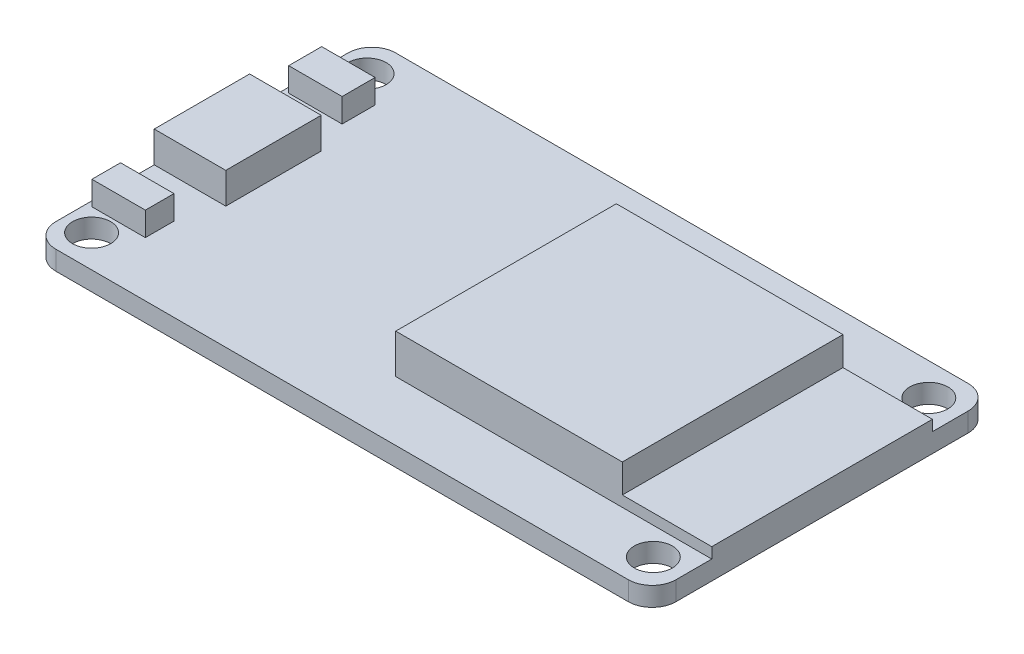
ISO-10303-21;
HEADER;
FILE_DESCRIPTION(('STEP AP214'),'2;1');
FILE_NAME('part.step','',(''),(''),'','','');
FILE_SCHEMA(('AUTOMOTIVE_DESIGN { 1 0 10303 214 1 1 1 1 }'));
ENDSEC;
DATA;
#1=APPLICATION_CONTEXT('core data for automotive mechanical design processes');
#2=APPLICATION_PROTOCOL_DEFINITION('international standard','automotive_design',2000,#1);
#3=PRODUCT_CONTEXT('',#1,'mechanical');
#4=PRODUCT('Part','Part','',(#3));
#5=PRODUCT_RELATED_PRODUCT_CATEGORY('part','',(#4));
#6=PRODUCT_DEFINITION_FORMATION('','',#4);
#7=PRODUCT_DEFINITION_CONTEXT('part definition',#1,'design');
#8=PRODUCT_DEFINITION('design','',#6,#7);
#9=PRODUCT_DEFINITION_SHAPE('','',#8);
#10=(LENGTH_UNIT() NAMED_UNIT(*) SI_UNIT(.MILLI.,.METRE.));
#11=(NAMED_UNIT(*) PLANE_ANGLE_UNIT() SI_UNIT($,.RADIAN.));
#12=(NAMED_UNIT(*) SI_UNIT($,.STERADIAN.) SOLID_ANGLE_UNIT());
#13=UNCERTAINTY_MEASURE_WITH_UNIT(LENGTH_MEASURE(1.E-05),#10,'distance_accuracy_value','');
#14=(GEOMETRIC_REPRESENTATION_CONTEXT(3) GLOBAL_UNCERTAINTY_ASSIGNED_CONTEXT((#13)) GLOBAL_UNIT_ASSIGNED_CONTEXT((#10,
#11,#12)) REPRESENTATION_CONTEXT('',''));
#15=CARTESIAN_POINT('',(0.,0.,0.));
#16=DIRECTION('',(0.,0.,1.));
#17=DIRECTION('',(1.,0.,0.));
#18=AXIS2_PLACEMENT_3D('',#15,#16,#17);
#19=CARTESIAN_POINT('',(0.,1.6,0.));
#20=DIRECTION('',(0.,1.,0.));
#21=DIRECTION('',(0.,0.,1.));
#22=AXIS2_PLACEMENT_3D('',#19,#20,#21);
#23=PLANE('',#22);
#24=CARTESIAN_POINT('',(23.4,1.6,-11.55));
#25=DIRECTION('',(0.,1.,0.));
#26=DIRECTION('',(0.,0.,1.));
#27=AXIS2_PLACEMENT_3D('',#24,#25,#26);
#28=CIRCLE('',#27,1.6);
#29=CARTESIAN_POINT('',(23.4,1.6,-9.95));
#30=VERTEX_POINT('',#29);
#31=EDGE_CURVE('E359',#30,#30,#28,.T.);
#32=ORIENTED_EDGE('',*,*,#31,.F.);
#33=EDGE_LOOP('',(#32));
#34=FACE_BOUND('',#33,.T.);
#35=CARTESIAN_POINT('',(23.4,1.6,11.55));
#36=DIRECTION('',(0.,1.,0.));
#37=DIRECTION('',(0.,0.,1.));
#38=AXIS2_PLACEMENT_3D('',#35,#36,#37);
#39=CIRCLE('',#38,1.6);
#40=CARTESIAN_POINT('',(23.4,1.6,13.15));
#41=VERTEX_POINT('',#40);
#42=EDGE_CURVE('E371',#41,#41,#39,.T.);
#43=ORIENTED_EDGE('',*,*,#42,.F.);
#44=EDGE_LOOP('',(#43));
#45=FACE_BOUND('',#44,.T.);
#46=CARTESIAN_POINT('',(-23.7,1.6,-11.55));
#47=DIRECTION('',(0.,1.,0.));
#48=DIRECTION('',(0.,0.,1.));
#49=AXIS2_PLACEMENT_3D('',#46,#47,#48);
#50=CIRCLE('',#49,1.6);
#51=CARTESIAN_POINT('',(-23.7,1.6,-9.95));
#52=VERTEX_POINT('',#51);
#53=EDGE_CURVE('E365',#52,#52,#50,.T.);
#54=ORIENTED_EDGE('',*,*,#53,.F.);
#55=EDGE_LOOP('',(#54));
#56=FACE_BOUND('',#55,.T.);
#57=CARTESIAN_POINT('',(-23.7,1.6,11.55));
#58=DIRECTION('',(0.,1.,0.));
#59=DIRECTION('',(0.,0.,1.));
#60=AXIS2_PLACEMENT_3D('',#57,#58,#59);
#61=CIRCLE('',#60,1.6);
#62=CARTESIAN_POINT('',(-23.7,1.6,13.15));
#63=VERTEX_POINT('',#62);
#64=EDGE_CURVE('E353',#63,#63,#61,.T.);
#65=ORIENTED_EDGE('',*,*,#64,.F.);
#66=EDGE_LOOP('',(#65));
#67=FACE_BOUND('',#66,.T.);
#68=DIRECTION('',(0.,0.,1.));
#69=VECTOR('',#68,1.);
#70=CARTESIAN_POINT('',(-0.5,1.6,9.25000000000001));
#71=LINE('',#70,#69);
#72=CARTESIAN_POINT('',(-0.500000000000004,1.6,-9.25));
#73=VERTEX_POINT('',#72);
#74=CARTESIAN_POINT('',(-0.5,1.6,9.25000000000001));
#75=VERTEX_POINT('',#74);
#76=EDGE_CURVE('E306',#73,#75,#71,.T.);
#77=ORIENTED_EDGE('',*,*,#76,.F.);
#78=DIRECTION('',(-1.,0.,0.));
#79=VECTOR('',#78,1.);
#80=CARTESIAN_POINT('',(26.,1.6,-9.25));
#81=LINE('',#80,#79);
#82=CARTESIAN_POINT('',(26.,1.6,-9.25));
#83=VERTEX_POINT('',#82);
#84=EDGE_CURVE('E294',#83,#73,#81,.T.);
#85=ORIENTED_EDGE('',*,*,#84,.F.);
#86=DIRECTION('',(0.,0.,-1.));
#87=VECTOR('',#86,1.);
#88=CARTESIAN_POINT('',(26.,1.6,14.25));
#89=LINE('',#88,#87);
#90=CARTESIAN_POINT('',(26.,1.6,-12.25));
#91=VERTEX_POINT('',#90);
#92=EDGE_CURVE('E383',#83,#91,#89,.T.);
#93=ORIENTED_EDGE('',*,*,#92,.T.);
#94=CARTESIAN_POINT('',(24.,1.6,-12.25));
#95=DIRECTION('',(0.,1.,0.));
#96=DIRECTION('',(0.,0.,1.));
#97=AXIS2_PLACEMENT_3D('',#94,#95,#96);
#98=CIRCLE('',#97,2.);
#99=CARTESIAN_POINT('',(24.,1.6,-14.25));
#100=VERTEX_POINT('',#99);
#101=EDGE_CURVE('E425',#91,#100,#98,.T.);
#102=ORIENTED_EDGE('',*,*,#101,.T.);
#103=DIRECTION('',(-1.,0.,0.));
#104=VECTOR('',#103,1.);
#105=CARTESIAN_POINT('',(26.,1.6,-14.25));
#106=LINE('',#105,#104);
#107=CARTESIAN_POINT('',(-24.,1.6,-14.25));
#108=VERTEX_POINT('',#107);
#109=EDGE_CURVE('E386',#100,#108,#106,.T.);
#110=ORIENTED_EDGE('',*,*,#109,.T.);
#111=CARTESIAN_POINT('',(-24.,1.6,-12.25));
#112=DIRECTION('',(0.,1.,0.));
#113=DIRECTION('',(0.,0.,1.));
#114=AXIS2_PLACEMENT_3D('',#111,#112,#113);
#115=CIRCLE('',#114,2.);
#116=CARTESIAN_POINT('',(-26.,1.6,-12.25));
#117=VERTEX_POINT('',#116);
#118=EDGE_CURVE('E421',#108,#117,#115,.T.);
#119=ORIENTED_EDGE('',*,*,#118,.T.);
#120=DIRECTION('',(0.,0.,1.));
#121=VECTOR('',#120,1.);
#122=CARTESIAN_POINT('',(-26.,1.6,14.25));
#123=LINE('',#122,#121);
#124=CARTESIAN_POINT('',(-26.,1.6,-3.99999999999999));
#125=VERTEX_POINT('',#124);
#126=EDGE_CURVE('E377',#117,#125,#123,.T.);
#127=ORIENTED_EDGE('',*,*,#126,.T.);
#128=DIRECTION('',(-1.,0.,0.));
#129=VECTOR('',#128,1.);
#130=CARTESIAN_POINT('',(-26.,1.6,-4.));
#131=LINE('',#130,#129);
#132=CARTESIAN_POINT('',(-20.,1.6,-4.));
#133=VERTEX_POINT('',#132);
#134=EDGE_CURVE('E327',#133,#125,#131,.T.);
#135=ORIENTED_EDGE('',*,*,#134,.F.);
#136=DIRECTION('',(0.,0.,-1.));
#137=VECTOR('',#136,1.);
#138=CARTESIAN_POINT('',(-20.,1.6,4.));
#139=LINE('',#138,#137);
#140=CARTESIAN_POINT('',(-20.,1.6,4.));
#141=VERTEX_POINT('',#140);
#142=EDGE_CURVE('E336',#141,#133,#139,.T.);
#143=ORIENTED_EDGE('',*,*,#142,.F.);
#144=DIRECTION('',(1.,0.,0.));
#145=VECTOR('',#144,1.);
#146=CARTESIAN_POINT('',(-26.,1.6,4.));
#147=LINE('',#146,#145);
#148=CARTESIAN_POINT('',(-26.,1.6,4.));
#149=VERTEX_POINT('',#148);
#150=EDGE_CURVE('E322',#149,#141,#147,.T.);
#151=ORIENTED_EDGE('',*,*,#150,.F.);
#152=CARTESIAN_POINT('',(-26.,1.6,12.25));
#153=VERTEX_POINT('',#152);
#154=EDGE_CURVE('E380',#149,#153,#123,.T.);
#155=ORIENTED_EDGE('',*,*,#154,.T.);
#156=CARTESIAN_POINT('',(-24.,1.6,12.25));
#157=DIRECTION('',(0.,1.,0.));
#158=DIRECTION('',(0.,0.,1.));
#159=AXIS2_PLACEMENT_3D('',#156,#157,#158);
#160=CIRCLE('',#159,2.);
#161=CARTESIAN_POINT('',(-24.,1.6,14.25));
#162=VERTEX_POINT('',#161);
#163=EDGE_CURVE('E419',#153,#162,#160,.T.);
#164=ORIENTED_EDGE('',*,*,#163,.T.);
#165=DIRECTION('',(1.,0.,0.));
#166=VECTOR('',#165,1.);
#167=CARTESIAN_POINT('',(26.,1.6,14.25));
#168=LINE('',#167,#166);
#169=CARTESIAN_POINT('',(24.,1.6,14.25));
#170=VERTEX_POINT('',#169);
#171=EDGE_CURVE('E379',#162,#170,#168,.T.);
#172=ORIENTED_EDGE('',*,*,#171,.T.);
#173=CARTESIAN_POINT('',(24.,1.6,12.25));
#174=DIRECTION('',(0.,1.,0.));
#175=DIRECTION('',(0.,0.,1.));
#176=AXIS2_PLACEMENT_3D('',#173,#174,#175);
#177=CIRCLE('',#176,2.);
#178=CARTESIAN_POINT('',(26.,1.6,12.25));
#179=VERTEX_POINT('',#178);
#180=EDGE_CURVE('E423',#170,#179,#177,.T.);
#181=ORIENTED_EDGE('',*,*,#180,.T.);
#182=CARTESIAN_POINT('',(26.,1.6,9.25000000000001));
#183=VERTEX_POINT('',#182);
#184=EDGE_CURVE('E384',#179,#183,#89,.T.);
#185=ORIENTED_EDGE('',*,*,#184,.T.);
#186=DIRECTION('',(1.,0.,0.));
#187=VECTOR('',#186,1.);
#188=CARTESIAN_POINT('',(26.,1.6,9.25));
#189=LINE('',#188,#187);
#190=EDGE_CURVE('E299',#75,#183,#189,.T.);
#191=ORIENTED_EDGE('',*,*,#190,.F.);
#192=EDGE_LOOP('',(#77,#85,#93,#102,#110,#119,#127,#135,#143,#151,#155,#164,#172,#181,#185,#191));
#193=FACE_BOUND('',#192,.T.);
#194=DIRECTION('',(1.,0.,0.));
#195=VECTOR('',#194,1.);
#196=CARTESIAN_POINT('',(-25.5637665283371,1.6,-6.83896640629226));
#197=LINE('',#196,#195);
#198=CARTESIAN_POINT('',(-25.5637665283371,1.6,-6.83896640629226));
#199=VERTEX_POINT('',#198);
#200=CARTESIAN_POINT('',(-21.0835187862574,1.6,-6.83896640629226));
#201=VERTEX_POINT('',#200);
#202=EDGE_CURVE('E241',#199,#201,#197,.T.);
#203=ORIENTED_EDGE('',*,*,#202,.F.);
#204=DIRECTION('',(0.,0.,1.));
#205=VECTOR('',#204,1.);
#206=CARTESIAN_POINT('',(-25.5637665283371,1.6,-9.60617824698855));
#207=LINE('',#206,#205);
#208=CARTESIAN_POINT('',(-25.5637665283371,1.6,-9.60617824698855));
#209=VERTEX_POINT('',#208);
#210=EDGE_CURVE('E238',#209,#199,#207,.T.);
#211=ORIENTED_EDGE('',*,*,#210,.F.);
#212=DIRECTION('',(-1.,0.,0.));
#213=VECTOR('',#212,1.);
#214=CARTESIAN_POINT('',(-25.5637665283371,1.6,-9.60617824698855));
#215=LINE('',#214,#213);
#216=CARTESIAN_POINT('',(-21.0835187862574,1.6,-9.60617824698855));
#217=VERTEX_POINT('',#216);
#218=EDGE_CURVE('E256',#217,#209,#215,.T.);
#219=ORIENTED_EDGE('',*,*,#218,.F.);
#220=DIRECTION('',(0.,0.,-1.));
#221=VECTOR('',#220,1.);
#222=CARTESIAN_POINT('',(-21.0835187862574,1.6,-9.60617824698855));
#223=LINE('',#222,#221);
#224=EDGE_CURVE('E264',#201,#217,#223,.T.);
#225=ORIENTED_EDGE('',*,*,#224,.F.);
#226=EDGE_LOOP('',(#203,#211,#219,#225));
#227=FACE_BOUND('',#226,.T.);
#228=DIRECTION('',(1.,0.,0.));
#229=VECTOR('',#228,1.);
#230=CARTESIAN_POINT('',(-25.5637665283371,1.6,9.65888704395417));
#231=LINE('',#230,#229);
#232=CARTESIAN_POINT('',(-25.5637665283371,1.6,9.65888704395417));
#233=VERTEX_POINT('',#232);
#234=CARTESIAN_POINT('',(-21.0835187862574,1.6,9.65888704395417));
#235=VERTEX_POINT('',#234);
#236=EDGE_CURVE('E237',#233,#235,#231,.T.);
#237=ORIENTED_EDGE('',*,*,#236,.F.);
#238=DIRECTION('',(0.,0.,1.));
#239=VECTOR('',#238,1.);
#240=CARTESIAN_POINT('',(-25.5637665283371,1.6,7.26063678201739));
#241=LINE('',#240,#239);
#242=CARTESIAN_POINT('',(-25.5637665283371,1.6,7.26063678201739));
#243=VERTEX_POINT('',#242);
#244=EDGE_CURVE('E232',#243,#233,#241,.T.);
#245=ORIENTED_EDGE('',*,*,#244,.F.);
#246=DIRECTION('',(-1.,0.,0.));
#247=VECTOR('',#246,1.);
#248=CARTESIAN_POINT('',(-25.5637665283371,1.6,7.26063678201739));
#249=LINE('',#248,#247);
#250=CARTESIAN_POINT('',(-21.0835187862574,1.6,7.26063678201739));
#251=VERTEX_POINT('',#250);
#252=EDGE_CURVE('E217',#251,#243,#249,.T.);
#253=ORIENTED_EDGE('',*,*,#252,.F.);
#254=DIRECTION('',(0.,0.,-1.));
#255=VECTOR('',#254,1.);
#256=CARTESIAN_POINT('',(-21.0835187862574,1.6,7.26063678201739));
#257=LINE('',#256,#255);
#258=EDGE_CURVE('E225',#235,#251,#257,.T.);
#259=ORIENTED_EDGE('',*,*,#258,.F.);
#260=EDGE_LOOP('',(#237,#245,#253,#259));
#261=FACE_BOUND('',#260,.T.);
#262=ADVANCED_FACE('F43',(#34,#45,#56,#67,#193,#227,#261),#23,.T.);
#263=CARTESIAN_POINT('',(0.,0.,0.));
#264=DIRECTION('',(0.,1.,0.));
#265=DIRECTION('',(0.,0.,1.));
#266=AXIS2_PLACEMENT_3D('',#263,#264,#265);
#267=PLANE('',#266);
#268=DIRECTION('',(-1.,0.,0.));
#269=VECTOR('',#268,1.);
#270=CARTESIAN_POINT('',(26.,0.,-14.25));
#271=LINE('',#270,#269);
#272=CARTESIAN_POINT('',(24.,0.,-14.25));
#273=VERTEX_POINT('',#272);
#274=CARTESIAN_POINT('',(-24.,0.,-14.25));
#275=VERTEX_POINT('',#274);
#276=EDGE_CURVE('E398',#273,#275,#271,.T.);
#277=ORIENTED_EDGE('',*,*,#276,.F.);
#278=CARTESIAN_POINT('',(24.,0.,-12.25));
#279=DIRECTION('',(0.,1.,0.));
#280=DIRECTION('',(0.,0.,1.));
#281=AXIS2_PLACEMENT_3D('',#278,#279,#280);
#282=CIRCLE('',#281,2.);
#283=CARTESIAN_POINT('',(26.,0.,-12.25));
#284=VERTEX_POINT('',#283);
#285=EDGE_CURVE('E411',#273,#284,#282,.F.);
#286=ORIENTED_EDGE('',*,*,#285,.T.);
#287=DIRECTION('',(0.,0.,-1.));
#288=VECTOR('',#287,1.);
#289=CARTESIAN_POINT('',(26.,0.,14.25));
#290=LINE('',#289,#288);
#291=CARTESIAN_POINT('',(26.,0.,12.25));
#292=VERTEX_POINT('',#291);
#293=EDGE_CURVE('E395',#292,#284,#290,.T.);
#294=ORIENTED_EDGE('',*,*,#293,.F.);
#295=CARTESIAN_POINT('',(24.,0.,12.25));
#296=DIRECTION('',(0.,1.,0.));
#297=DIRECTION('',(0.,0.,1.));
#298=AXIS2_PLACEMENT_3D('',#295,#296,#297);
#299=CIRCLE('',#298,2.);
#300=CARTESIAN_POINT('',(24.,0.,14.25));
#301=VERTEX_POINT('',#300);
#302=EDGE_CURVE('E409',#292,#301,#299,.F.);
#303=ORIENTED_EDGE('',*,*,#302,.T.);
#304=DIRECTION('',(1.,0.,0.));
#305=VECTOR('',#304,1.);
#306=CARTESIAN_POINT('',(26.,0.,14.25));
#307=LINE('',#306,#305);
#308=CARTESIAN_POINT('',(-24.,0.,14.25));
#309=VERTEX_POINT('',#308);
#310=EDGE_CURVE('E392',#309,#301,#307,.T.);
#311=ORIENTED_EDGE('',*,*,#310,.F.);
#312=CARTESIAN_POINT('',(-24.,0.,12.25));
#313=DIRECTION('',(0.,1.,0.));
#314=DIRECTION('',(0.,0.,1.));
#315=AXIS2_PLACEMENT_3D('',#312,#313,#314);
#316=CIRCLE('',#315,2.);
#317=CARTESIAN_POINT('',(-26.,0.,12.25));
#318=VERTEX_POINT('',#317);
#319=EDGE_CURVE('E405',#309,#318,#316,.F.);
#320=ORIENTED_EDGE('',*,*,#319,.T.);
#321=DIRECTION('',(0.,0.,1.));
#322=VECTOR('',#321,1.);
#323=CARTESIAN_POINT('',(-26.,0.,14.25));
#324=LINE('',#323,#322);
#325=CARTESIAN_POINT('',(-26.,0.,-12.25));
#326=VERTEX_POINT('',#325);
#327=EDGE_CURVE('E374',#326,#318,#324,.T.);
#328=ORIENTED_EDGE('',*,*,#327,.F.);
#329=CARTESIAN_POINT('',(-24.,0.,-12.25));
#330=DIRECTION('',(0.,1.,0.));
#331=DIRECTION('',(0.,0.,1.));
#332=AXIS2_PLACEMENT_3D('',#329,#330,#331);
#333=CIRCLE('',#332,2.);
#334=EDGE_CURVE('E407',#326,#275,#333,.F.);
#335=ORIENTED_EDGE('',*,*,#334,.T.);
#336=EDGE_LOOP('',(#277,#286,#294,#303,#311,#320,#328,#335));
#337=FACE_BOUND('',#336,.T.);
#338=CARTESIAN_POINT('',(23.4,0.,11.55));
#339=DIRECTION('',(0.,1.,0.));
#340=DIRECTION('',(0.,0.,1.));
#341=AXIS2_PLACEMENT_3D('',#338,#339,#340);
#342=CIRCLE('',#341,1.6);
#343=CARTESIAN_POINT('',(23.4,0.,13.15));
#344=VERTEX_POINT('',#343);
#345=EDGE_CURVE('E368',#344,#344,#342,.T.);
#346=ORIENTED_EDGE('',*,*,#345,.T.);
#347=EDGE_LOOP('',(#346));
#348=FACE_BOUND('',#347,.T.);
#349=CARTESIAN_POINT('',(-23.7,0.,-11.55));
#350=DIRECTION('',(0.,1.,0.));
#351=DIRECTION('',(0.,0.,1.));
#352=AXIS2_PLACEMENT_3D('',#349,#350,#351);
#353=CIRCLE('',#352,1.6);
#354=CARTESIAN_POINT('',(-23.7,0.,-9.95));
#355=VERTEX_POINT('',#354);
#356=EDGE_CURVE('E362',#355,#355,#353,.T.);
#357=ORIENTED_EDGE('',*,*,#356,.T.);
#358=EDGE_LOOP('',(#357));
#359=FACE_BOUND('',#358,.T.);
#360=CARTESIAN_POINT('',(23.4,0.,-11.55));
#361=DIRECTION('',(0.,1.,0.));
#362=DIRECTION('',(0.,0.,1.));
#363=AXIS2_PLACEMENT_3D('',#360,#361,#362);
#364=CIRCLE('',#363,1.6);
#365=CARTESIAN_POINT('',(23.4,0.,-9.95));
#366=VERTEX_POINT('',#365);
#367=EDGE_CURVE('E356',#366,#366,#364,.T.);
#368=ORIENTED_EDGE('',*,*,#367,.T.);
#369=EDGE_LOOP('',(#368));
#370=FACE_BOUND('',#369,.T.);
#371=CARTESIAN_POINT('',(-23.7,0.,11.55));
#372=DIRECTION('',(0.,1.,0.));
#373=DIRECTION('',(0.,0.,1.));
#374=AXIS2_PLACEMENT_3D('',#371,#372,#373);
#375=CIRCLE('',#374,1.6);
#376=CARTESIAN_POINT('',(-23.7,0.,13.15));
#377=VERTEX_POINT('',#376);
#378=EDGE_CURVE('E352',#377,#377,#375,.T.);
#379=ORIENTED_EDGE('',*,*,#378,.T.);
#380=EDGE_LOOP('',(#379));
#381=FACE_BOUND('',#380,.T.);
#382=ADVANCED_FACE('F492',(#337,#348,#359,#370,#381),#267,.F.);
#383=CARTESIAN_POINT('',(-26.,1.6,14.25));
#384=DIRECTION('',(1.,0.,0.));
#385=DIRECTION('',(0.,0.,-1.));
#386=AXIS2_PLACEMENT_3D('',#383,#384,#385);
#387=PLANE('',#386);
#388=ORIENTED_EDGE('',*,*,#126,.F.);
#389=DIRECTION('',(0.,-1.,0.));
#390=VECTOR('',#389,1.);
#391=CARTESIAN_POINT('',(-26.,1.6,-12.25));
#392=LINE('',#391,#390);
#393=EDGE_CURVE('E11',#117,#326,#392,.T.);
#394=ORIENTED_EDGE('',*,*,#393,.T.);
#395=ORIENTED_EDGE('',*,*,#327,.T.);
#396=DIRECTION('',(0.,-1.,0.));
#397=VECTOR('',#396,1.);
#398=CARTESIAN_POINT('',(-26.,1.6,12.25));
#399=LINE('',#398,#397);
#400=EDGE_CURVE('E51',#318,#153,#399,.F.);
#401=ORIENTED_EDGE('',*,*,#400,.T.);
#402=ORIENTED_EDGE('',*,*,#154,.F.);
#403=DIRECTION('',(0.,-1.,0.));
#404=VECTOR('',#403,1.);
#405=CARTESIAN_POINT('',(-26.,4.2,4.));
#406=LINE('',#405,#404);
#407=CARTESIAN_POINT('',(-26.,4.2,4.));
#408=VERTEX_POINT('',#407);
#409=EDGE_CURVE('E349',#408,#149,#406,.T.);
#410=ORIENTED_EDGE('',*,*,#409,.F.);
#411=DIRECTION('',(0.,0.,1.));
#412=VECTOR('',#411,1.);
#413=CARTESIAN_POINT('',(-26.,4.2,4.));
#414=LINE('',#413,#412);
#415=CARTESIAN_POINT('',(-26.,4.2,-4.));
#416=VERTEX_POINT('',#415);
#417=EDGE_CURVE('E323',#416,#408,#414,.T.);
#418=ORIENTED_EDGE('',*,*,#417,.F.);
#419=DIRECTION('',(0.,-1.,0.));
#420=VECTOR('',#419,1.);
#421=CARTESIAN_POINT('',(-26.,4.2,-4.));
#422=LINE('',#421,#420);
#423=EDGE_CURVE('E333',#416,#125,#422,.T.);
#424=ORIENTED_EDGE('',*,*,#423,.T.);
#425=EDGE_LOOP('',(#388,#394,#395,#401,#402,#410,#418,#424));
#426=FACE_BOUND('',#425,.T.);
#427=ADVANCED_FACE('F437',(#426),#387,.F.);
#428=CARTESIAN_POINT('',(26.,1.6,14.25));
#429=DIRECTION('',(0.,0.,-1.));
#430=DIRECTION('',(-1.,0.,0.));
#431=AXIS2_PLACEMENT_3D('',#428,#429,#430);
#432=PLANE('',#431);
#433=ORIENTED_EDGE('',*,*,#310,.T.);
#434=DIRECTION('',(0.,-1.,0.));
#435=VECTOR('',#434,1.);
#436=CARTESIAN_POINT('',(24.,1.6,14.25));
#437=LINE('',#436,#435);
#438=EDGE_CURVE('E430',#301,#170,#437,.F.);
#439=ORIENTED_EDGE('',*,*,#438,.T.);
#440=ORIENTED_EDGE('',*,*,#171,.F.);
#441=DIRECTION('',(0.,-1.,0.));
#442=VECTOR('',#441,1.);
#443=CARTESIAN_POINT('',(-24.,1.6,14.25));
#444=LINE('',#443,#442);
#445=EDGE_CURVE('E427',#162,#309,#444,.T.);
#446=ORIENTED_EDGE('',*,*,#445,.T.);
#447=EDGE_LOOP('',(#433,#439,#440,#446));
#448=FACE_BOUND('',#447,.T.);
#449=ADVANCED_FACE('F447',(#448),#432,.F.);
#450=CARTESIAN_POINT('',(26.,1.6,14.25));
#451=DIRECTION('',(-1.,0.,0.));
#452=DIRECTION('',(0.,0.,1.));
#453=AXIS2_PLACEMENT_3D('',#450,#451,#452);
#454=PLANE('',#453);
#455=ORIENTED_EDGE('',*,*,#293,.T.);
#456=DIRECTION('',(0.,-1.,0.));
#457=VECTOR('',#456,1.);
#458=CARTESIAN_POINT('',(26.,1.6,-12.25));
#459=LINE('',#458,#457);
#460=EDGE_CURVE('E416',#284,#91,#459,.F.);
#461=ORIENTED_EDGE('',*,*,#460,.T.);
#462=ORIENTED_EDGE('',*,*,#92,.F.);
#463=DIRECTION('',(0.,-1.,0.));
#464=VECTOR('',#463,1.);
#465=CARTESIAN_POINT('',(26.,2.5,-9.25));
#466=LINE('',#465,#464);
#467=CARTESIAN_POINT('',(26.,2.5,-9.25));
#468=VERTEX_POINT('',#467);
#469=EDGE_CURVE('E319',#468,#83,#466,.T.);
#470=ORIENTED_EDGE('',*,*,#469,.F.);
#471=DIRECTION('',(0.,0.,-1.));
#472=VECTOR('',#471,1.);
#473=CARTESIAN_POINT('',(26.,2.5,9.25));
#474=LINE('',#473,#472);
#475=CARTESIAN_POINT('',(26.,2.5,9.25));
#476=VERTEX_POINT('',#475);
#477=EDGE_CURVE('E295',#476,#468,#474,.T.);
#478=ORIENTED_EDGE('',*,*,#477,.F.);
#479=DIRECTION('',(0.,-1.,0.));
#480=VECTOR('',#479,1.);
#481=CARTESIAN_POINT('',(26.,2.5,9.25));
#482=LINE('',#481,#480);
#483=EDGE_CURVE('E303',#476,#183,#482,.T.);
#484=ORIENTED_EDGE('',*,*,#483,.T.);
#485=ORIENTED_EDGE('',*,*,#184,.F.);
#486=DIRECTION('',(0.,-1.,0.));
#487=VECTOR('',#486,1.);
#488=CARTESIAN_POINT('',(26.,1.6,12.25));
#489=LINE('',#488,#487);
#490=EDGE_CURVE('E413',#179,#292,#489,.T.);
#491=ORIENTED_EDGE('',*,*,#490,.T.);
#492=EDGE_LOOP('',(#455,#461,#462,#470,#478,#484,#485,#491));
#493=FACE_BOUND('',#492,.T.);
#494=ADVANCED_FACE('F455',(#493),#454,.F.);
#495=CARTESIAN_POINT('',(26.,1.6,-14.25));
#496=DIRECTION('',(0.,0.,1.));
#497=DIRECTION('',(1.,0.,0.));
#498=AXIS2_PLACEMENT_3D('',#495,#496,#497);
#499=PLANE('',#498);
#500=ORIENTED_EDGE('',*,*,#109,.F.);
#501=DIRECTION('',(0.,-1.,0.));
#502=VECTOR('',#501,1.);
#503=CARTESIAN_POINT('',(24.,1.6,-14.25));
#504=LINE('',#503,#502);
#505=EDGE_CURVE('E402',#100,#273,#504,.T.);
#506=ORIENTED_EDGE('',*,*,#505,.T.);
#507=ORIENTED_EDGE('',*,*,#276,.T.);
#508=DIRECTION('',(0.,-1.,0.));
#509=VECTOR('',#508,1.);
#510=CARTESIAN_POINT('',(-24.,1.6,-14.25));
#511=LINE('',#510,#509);
#512=EDGE_CURVE('E389',#275,#108,#511,.F.);
#513=ORIENTED_EDGE('',*,*,#512,.T.);
#514=EDGE_LOOP('',(#500,#506,#507,#513));
#515=FACE_BOUND('',#514,.T.);
#516=ADVANCED_FACE('F487',(#515),#499,.F.);
#517=CARTESIAN_POINT('',(23.4,1.6,11.55));
#518=DIRECTION('',(0.,-1.,0.));
#519=DIRECTION('',(0.,0.,-1.));
#520=AXIS2_PLACEMENT_3D('',#517,#518,#519);
#521=CYLINDRICAL_SURFACE('',#520,1.6);
#522=ORIENTED_EDGE('',*,*,#42,.T.);
#523=EDGE_LOOP('',(#522));
#524=FACE_BOUND('',#523,.T.);
#525=ORIENTED_EDGE('',*,*,#345,.F.);
#526=EDGE_LOOP('',(#525));
#527=FACE_BOUND('',#526,.T.);
#528=ADVANCED_FACE('F529',(#524,#527),#521,.F.);
#529=CARTESIAN_POINT('',(-23.7,1.6,-11.55));
#530=DIRECTION('',(0.,-1.,0.));
#531=DIRECTION('',(0.,0.,-1.));
#532=AXIS2_PLACEMENT_3D('',#529,#530,#531);
#533=CYLINDRICAL_SURFACE('',#532,1.6);
#534=ORIENTED_EDGE('',*,*,#53,.T.);
#535=EDGE_LOOP('',(#534));
#536=FACE_BOUND('',#535,.T.);
#537=ORIENTED_EDGE('',*,*,#356,.F.);
#538=EDGE_LOOP('',(#537));
#539=FACE_BOUND('',#538,.T.);
#540=ADVANCED_FACE('F562',(#536,#539),#533,.F.);
#541=CARTESIAN_POINT('',(23.4,1.6,-11.55));
#542=DIRECTION('',(0.,-1.,0.));
#543=DIRECTION('',(0.,0.,-1.));
#544=AXIS2_PLACEMENT_3D('',#541,#542,#543);
#545=CYLINDRICAL_SURFACE('',#544,1.6);
#546=ORIENTED_EDGE('',*,*,#31,.T.);
#547=EDGE_LOOP('',(#546));
#548=FACE_BOUND('',#547,.T.);
#549=ORIENTED_EDGE('',*,*,#367,.F.);
#550=EDGE_LOOP('',(#549));
#551=FACE_BOUND('',#550,.T.);
#552=ADVANCED_FACE('F559',(#548,#551),#545,.F.);
#553=CARTESIAN_POINT('',(-23.7,1.6,11.55));
#554=DIRECTION('',(0.,-1.,0.));
#555=DIRECTION('',(0.,0.,-1.));
#556=AXIS2_PLACEMENT_3D('',#553,#554,#555);
#557=CYLINDRICAL_SURFACE('',#556,1.6);
#558=ORIENTED_EDGE('',*,*,#64,.T.);
#559=EDGE_LOOP('',(#558));
#560=FACE_BOUND('',#559,.T.);
#561=ORIENTED_EDGE('',*,*,#378,.F.);
#562=EDGE_LOOP('',(#561));
#563=FACE_BOUND('',#562,.T.);
#564=ADVANCED_FACE('F542',(#560,#563),#557,.F.);
#565=CARTESIAN_POINT('',(24.,1.6,-12.25));
#566=DIRECTION('',(0.,-1.,0.));
#567=DIRECTION('',(0.,0.,-1.));
#568=AXIS2_PLACEMENT_3D('',#565,#566,#567);
#569=CYLINDRICAL_SURFACE('',#568,2.);
#570=ORIENTED_EDGE('',*,*,#101,.F.);
#571=ORIENTED_EDGE('',*,*,#460,.F.);
#572=ORIENTED_EDGE('',*,*,#285,.F.);
#573=ORIENTED_EDGE('',*,*,#505,.F.);
#574=EDGE_LOOP('',(#570,#571,#572,#573));
#575=FACE_BOUND('',#574,.T.);
#576=ADVANCED_FACE('F490',(#575),#569,.T.);
#577=CARTESIAN_POINT('',(24.,1.6,12.25));
#578=DIRECTION('',(0.,-1.,0.));
#579=DIRECTION('',(0.,0.,-1.));
#580=AXIS2_PLACEMENT_3D('',#577,#578,#579);
#581=CYLINDRICAL_SURFACE('',#580,2.);
#582=ORIENTED_EDGE('',*,*,#180,.F.);
#583=ORIENTED_EDGE('',*,*,#438,.F.);
#584=ORIENTED_EDGE('',*,*,#302,.F.);
#585=ORIENTED_EDGE('',*,*,#490,.F.);
#586=EDGE_LOOP('',(#582,#583,#584,#585));
#587=FACE_BOUND('',#586,.T.);
#588=ADVANCED_FACE('F451',(#587),#581,.T.);
#589=CARTESIAN_POINT('',(-24.,1.6,-12.25));
#590=DIRECTION('',(0.,-1.,0.));
#591=DIRECTION('',(0.,0.,-1.));
#592=AXIS2_PLACEMENT_3D('',#589,#590,#591);
#593=CYLINDRICAL_SURFACE('',#592,2.);
#594=ORIENTED_EDGE('',*,*,#118,.F.);
#595=ORIENTED_EDGE('',*,*,#512,.F.);
#596=ORIENTED_EDGE('',*,*,#334,.F.);
#597=ORIENTED_EDGE('',*,*,#393,.F.);
#598=EDGE_LOOP('',(#594,#595,#596,#597));
#599=FACE_BOUND('',#598,.T.);
#600=ADVANCED_FACE('F495',(#599),#593,.T.);
#601=CARTESIAN_POINT('',(-24.,1.6,12.25));
#602=DIRECTION('',(0.,-1.,0.));
#603=DIRECTION('',(0.,0.,-1.));
#604=AXIS2_PLACEMENT_3D('',#601,#602,#603);
#605=CYLINDRICAL_SURFACE('',#604,2.);
#606=ORIENTED_EDGE('',*,*,#163,.F.);
#607=ORIENTED_EDGE('',*,*,#400,.F.);
#608=ORIENTED_EDGE('',*,*,#319,.F.);
#609=ORIENTED_EDGE('',*,*,#445,.F.);
#610=EDGE_LOOP('',(#606,#607,#608,#609));
#611=FACE_BOUND('',#610,.T.);
#612=ADVANCED_FACE('F45',(#611),#605,.T.);
#613=CARTESIAN_POINT('',(-26.,4.2,4.));
#614=DIRECTION('',(0.,0.,-1.));
#615=DIRECTION('',(-1.,0.,0.));
#616=AXIS2_PLACEMENT_3D('',#613,#614,#615);
#617=PLANE('',#616);
#618=ORIENTED_EDGE('',*,*,#150,.T.);
#619=DIRECTION('',(0.,-1.,0.));
#620=VECTOR('',#619,1.);
#621=CARTESIAN_POINT('',(-20.,4.2,4.));
#622=LINE('',#621,#620);
#623=CARTESIAN_POINT('',(-20.,4.2,4.));
#624=VERTEX_POINT('',#623);
#625=EDGE_CURVE('E346',#624,#141,#622,.T.);
#626=ORIENTED_EDGE('',*,*,#625,.F.);
#627=DIRECTION('',(1.,0.,0.));
#628=VECTOR('',#627,1.);
#629=CARTESIAN_POINT('',(-26.,4.2,4.));
#630=LINE('',#629,#628);
#631=EDGE_CURVE('E326',#408,#624,#630,.T.);
#632=ORIENTED_EDGE('',*,*,#631,.F.);
#633=ORIENTED_EDGE('',*,*,#409,.T.);
#634=EDGE_LOOP('',(#618,#626,#632,#633));
#635=FACE_BOUND('',#634,.T.);
#636=ADVANCED_FACE('F508',(#635),#617,.F.);
#637=CARTESIAN_POINT('',(-20.,4.2,4.));
#638=DIRECTION('',(-1.,0.,0.));
#639=DIRECTION('',(0.,0.,1.));
#640=AXIS2_PLACEMENT_3D('',#637,#638,#639);
#641=PLANE('',#640);
#642=ORIENTED_EDGE('',*,*,#142,.T.);
#643=DIRECTION('',(0.,-1.,0.));
#644=VECTOR('',#643,1.);
#645=CARTESIAN_POINT('',(-20.,4.2,-4.));
#646=LINE('',#645,#644);
#647=CARTESIAN_POINT('',(-20.,4.2,-4.));
#648=VERTEX_POINT('',#647);
#649=EDGE_CURVE('E343',#648,#133,#646,.T.);
#650=ORIENTED_EDGE('',*,*,#649,.F.);
#651=DIRECTION('',(0.,0.,-1.));
#652=VECTOR('',#651,1.);
#653=CARTESIAN_POINT('',(-20.,4.2,4.));
#654=LINE('',#653,#652);
#655=EDGE_CURVE('E329',#624,#648,#654,.T.);
#656=ORIENTED_EDGE('',*,*,#655,.F.);
#657=ORIENTED_EDGE('',*,*,#625,.T.);
#658=EDGE_LOOP('',(#642,#650,#656,#657));
#659=FACE_BOUND('',#658,.T.);
#660=ADVANCED_FACE('F504',(#659),#641,.F.);
#661=CARTESIAN_POINT('',(-26.,4.2,-4.));
#662=DIRECTION('',(0.,0.,1.));
#663=DIRECTION('',(1.,0.,0.));
#664=AXIS2_PLACEMENT_3D('',#661,#662,#663);
#665=PLANE('',#664);
#666=ORIENTED_EDGE('',*,*,#134,.T.);
#667=ORIENTED_EDGE('',*,*,#423,.F.);
#668=DIRECTION('',(-1.,0.,0.));
#669=VECTOR('',#668,1.);
#670=CARTESIAN_POINT('',(-26.,4.2,-4.));
#671=LINE('',#670,#669);
#672=EDGE_CURVE('E331',#648,#416,#671,.T.);
#673=ORIENTED_EDGE('',*,*,#672,.F.);
#674=ORIENTED_EDGE('',*,*,#649,.T.);
#675=EDGE_LOOP('',(#666,#667,#673,#674));
#676=FACE_BOUND('',#675,.T.);
#677=ADVANCED_FACE('F501',(#676),#665,.F.);
#678=CARTESIAN_POINT('',(0.,4.2,0.));
#679=DIRECTION('',(0.,-1.,0.));
#680=DIRECTION('',(0.,0.,-1.));
#681=AXIS2_PLACEMENT_3D('',#678,#679,#680);
#682=PLANE('',#681);
#683=ORIENTED_EDGE('',*,*,#417,.T.);
#684=ORIENTED_EDGE('',*,*,#631,.T.);
#685=ORIENTED_EDGE('',*,*,#655,.T.);
#686=ORIENTED_EDGE('',*,*,#672,.T.);
#687=EDGE_LOOP('',(#683,#684,#685,#686));
#688=FACE_BOUND('',#687,.T.);
#689=ADVANCED_FACE('F510',(#688),#682,.F.);
#690=CARTESIAN_POINT('',(26.,2.5,-9.25));
#691=DIRECTION('',(0.,0.,1.));
#692=DIRECTION('',(1.,0.,0.));
#693=AXIS2_PLACEMENT_3D('',#690,#691,#692);
#694=PLANE('',#693);
#695=ORIENTED_EDGE('',*,*,#84,.T.);
#696=DIRECTION('',(0.,-1.,0.));
#697=VECTOR('',#696,1.);
#698=CARTESIAN_POINT('',(-0.500000000000004,2.5,-9.25));
#699=LINE('',#698,#697);
#700=CARTESIAN_POINT('',(-0.500000000000004,4.9,-9.25));
#701=VERTEX_POINT('',#700);
#702=EDGE_CURVE('E316',#701,#73,#699,.T.);
#703=ORIENTED_EDGE('',*,*,#702,.F.);
#704=DIRECTION('',(-1.,0.,0.));
#705=VECTOR('',#704,1.);
#706=CARTESIAN_POINT('',(-0.500000000000004,4.9,-9.25));
#707=LINE('',#706,#705);
#708=CARTESIAN_POINT('',(18.5,4.9,-9.25));
#709=VERTEX_POINT('',#708);
#710=EDGE_CURVE('E283',#709,#701,#707,.T.);
#711=ORIENTED_EDGE('',*,*,#710,.F.);
#712=DIRECTION('',(0.,-1.,0.));
#713=VECTOR('',#712,1.);
#714=CARTESIAN_POINT('',(18.5,4.9,-9.25));
#715=LINE('',#714,#713);
#716=CARTESIAN_POINT('',(18.5,2.5,-9.25));
#717=VERTEX_POINT('',#716);
#718=EDGE_CURVE('E286',#709,#717,#715,.T.);
#719=ORIENTED_EDGE('',*,*,#718,.T.);
#720=DIRECTION('',(-1.,0.,0.));
#721=VECTOR('',#720,1.);
#722=CARTESIAN_POINT('',(26.,2.5,-9.25));
#723=LINE('',#722,#721);
#724=EDGE_CURVE('E298',#468,#717,#723,.T.);
#725=ORIENTED_EDGE('',*,*,#724,.F.);
#726=ORIENTED_EDGE('',*,*,#469,.T.);
#727=EDGE_LOOP('',(#695,#703,#711,#719,#725,#726));
#728=FACE_BOUND('',#727,.T.);
#729=ADVANCED_FACE('F471',(#728),#694,.F.);
#730=CARTESIAN_POINT('',(-0.5,2.5,9.25000000000001));
#731=DIRECTION('',(1.,0.,0.));
#732=DIRECTION('',(0.,0.,-1.));
#733=AXIS2_PLACEMENT_3D('',#730,#731,#732);
#734=PLANE('',#733);
#735=ORIENTED_EDGE('',*,*,#76,.T.);
#736=DIRECTION('',(0.,-1.,0.));
#737=VECTOR('',#736,1.);
#738=CARTESIAN_POINT('',(-0.5,2.5,9.25000000000001));
#739=LINE('',#738,#737);
#740=CARTESIAN_POINT('',(-0.500000000000004,4.9,9.25000000000001));
#741=VERTEX_POINT('',#740);
#742=EDGE_CURVE('E313',#741,#75,#739,.T.);
#743=ORIENTED_EDGE('',*,*,#742,.F.);
#744=DIRECTION('',(0.,0.,1.));
#745=VECTOR('',#744,1.);
#746=CARTESIAN_POINT('',(-0.500000000000004,4.9,-9.25));
#747=LINE('',#746,#745);
#748=EDGE_CURVE('E276',#701,#741,#747,.T.);
#749=ORIENTED_EDGE('',*,*,#748,.F.);
#750=ORIENTED_EDGE('',*,*,#702,.T.);
#751=EDGE_LOOP('',(#735,#743,#749,#750));
#752=FACE_BOUND('',#751,.T.);
#753=ADVANCED_FACE('F467',(#752),#734,.F.);
#754=CARTESIAN_POINT('',(26.,2.5,9.25));
#755=DIRECTION('',(0.,0.,-1.));
#756=DIRECTION('',(-1.,0.,0.));
#757=AXIS2_PLACEMENT_3D('',#754,#755,#756);
#758=PLANE('',#757);
#759=ORIENTED_EDGE('',*,*,#190,.T.);
#760=ORIENTED_EDGE('',*,*,#483,.F.);
#761=DIRECTION('',(1.,0.,0.));
#762=VECTOR('',#761,1.);
#763=CARTESIAN_POINT('',(26.,2.5,9.25));
#764=LINE('',#763,#762);
#765=CARTESIAN_POINT('',(18.5,2.5,9.25));
#766=VERTEX_POINT('',#765);
#767=EDGE_CURVE('E301',#766,#476,#764,.T.);
#768=ORIENTED_EDGE('',*,*,#767,.F.);
#769=DIRECTION('',(0.,-1.,0.));
#770=VECTOR('',#769,1.);
#771=CARTESIAN_POINT('',(18.5,4.9,9.25000000000001));
#772=LINE('',#771,#770);
#773=CARTESIAN_POINT('',(18.5,4.9,9.25000000000001));
#774=VERTEX_POINT('',#773);
#775=EDGE_CURVE('E291',#774,#766,#772,.T.);
#776=ORIENTED_EDGE('',*,*,#775,.F.);
#777=DIRECTION('',(1.,0.,0.));
#778=VECTOR('',#777,1.);
#779=CARTESIAN_POINT('',(-0.500000000000004,4.9,9.25000000000001));
#780=LINE('',#779,#778);
#781=EDGE_CURVE('E279',#741,#774,#780,.T.);
#782=ORIENTED_EDGE('',*,*,#781,.F.);
#783=ORIENTED_EDGE('',*,*,#742,.T.);
#784=EDGE_LOOP('',(#759,#760,#768,#776,#782,#783));
#785=FACE_BOUND('',#784,.T.);
#786=ADVANCED_FACE('F462',(#785),#758,.F.);
#787=CARTESIAN_POINT('',(0.,2.5,0.));
#788=DIRECTION('',(0.,1.,0.));
#789=DIRECTION('',(0.,0.,1.));
#790=AXIS2_PLACEMENT_3D('',#787,#788,#789);
#791=PLANE('',#790);
#792=DIRECTION('',(0.,0.,-1.));
#793=VECTOR('',#792,1.);
#794=CARTESIAN_POINT('',(18.5,2.5,-9.25));
#795=LINE('',#794,#793);
#796=EDGE_CURVE('E275',#766,#717,#795,.T.);
#797=ORIENTED_EDGE('',*,*,#796,.F.);
#798=ORIENTED_EDGE('',*,*,#767,.T.);
#799=ORIENTED_EDGE('',*,*,#477,.T.);
#800=ORIENTED_EDGE('',*,*,#724,.T.);
#801=EDGE_LOOP('',(#797,#798,#799,#800));
#802=FACE_BOUND('',#801,.T.);
#803=ADVANCED_FACE('F479',(#802),#791,.T.);
#804=CARTESIAN_POINT('',(18.5,4.9,-9.25));
#805=DIRECTION('',(-1.,0.,0.));
#806=DIRECTION('',(0.,0.,1.));
#807=AXIS2_PLACEMENT_3D('',#804,#805,#806);
#808=PLANE('',#807);
#809=ORIENTED_EDGE('',*,*,#796,.T.);
#810=ORIENTED_EDGE('',*,*,#718,.F.);
#811=DIRECTION('',(0.,0.,-1.));
#812=VECTOR('',#811,1.);
#813=CARTESIAN_POINT('',(18.5,4.9,-9.25));
#814=LINE('',#813,#812);
#815=EDGE_CURVE('E281',#774,#709,#814,.T.);
#816=ORIENTED_EDGE('',*,*,#815,.F.);
#817=ORIENTED_EDGE('',*,*,#775,.T.);
#818=EDGE_LOOP('',(#809,#810,#816,#817));
#819=FACE_BOUND('',#818,.T.);
#820=ADVANCED_FACE('F477',(#819),#808,.F.);
#821=CARTESIAN_POINT('',(0.,4.9,0.));
#822=DIRECTION('',(0.,1.,0.));
#823=DIRECTION('',(0.,0.,1.));
#824=AXIS2_PLACEMENT_3D('',#821,#822,#823);
#825=PLANE('',#824);
#826=ORIENTED_EDGE('',*,*,#748,.T.);
#827=ORIENTED_EDGE('',*,*,#781,.T.);
#828=ORIENTED_EDGE('',*,*,#815,.T.);
#829=ORIENTED_EDGE('',*,*,#710,.T.);
#830=EDGE_LOOP('',(#826,#827,#828,#829));
#831=FACE_BOUND('',#830,.T.);
#832=ADVANCED_FACE('F473',(#831),#825,.T.);
#833=CARTESIAN_POINT('',(-25.5637665283371,3.6,-9.60617824698855));
#834=DIRECTION('',(1.,0.,0.));
#835=DIRECTION('',(0.,0.,-1.));
#836=AXIS2_PLACEMENT_3D('',#833,#834,#835);
#837=PLANE('',#836);
#838=ORIENTED_EDGE('',*,*,#210,.T.);
#839=DIRECTION('',(0.,-1.,0.));
#840=VECTOR('',#839,1.);
#841=CARTESIAN_POINT('',(-25.5637665283371,3.6,-6.83896640629226));
#842=LINE('',#841,#840);
#843=CARTESIAN_POINT('',(-25.5637665283371,3.6,-6.83896640629226));
#844=VERTEX_POINT('',#843);
#845=EDGE_CURVE('E273',#844,#199,#842,.T.);
#846=ORIENTED_EDGE('',*,*,#845,.F.);
#847=DIRECTION('',(0.,0.,1.));
#848=VECTOR('',#847,1.);
#849=CARTESIAN_POINT('',(-25.5637665283371,3.6,-9.60617824698855));
#850=LINE('',#849,#848);
#851=CARTESIAN_POINT('',(-25.5637665283371,3.6,-9.60617824698855));
#852=VERTEX_POINT('',#851);
#853=EDGE_CURVE('E252',#852,#844,#850,.T.);
#854=ORIENTED_EDGE('',*,*,#853,.F.);
#855=DIRECTION('',(0.,-1.,0.));
#856=VECTOR('',#855,1.);
#857=CARTESIAN_POINT('',(-25.5637665283371,3.6,-9.60617824698855));
#858=LINE('',#857,#856);
#859=EDGE_CURVE('E261',#852,#209,#858,.T.);
#860=ORIENTED_EDGE('',*,*,#859,.T.);
#861=EDGE_LOOP('',(#838,#846,#854,#860));
#862=FACE_BOUND('',#861,.T.);
#863=ADVANCED_FACE('F755',(#862),#837,.F.);
#864=CARTESIAN_POINT('',(-25.5637665283371,3.6,-6.83896640629226));
#865=DIRECTION('',(0.,0.,-1.));
#866=DIRECTION('',(-1.,0.,0.));
#867=AXIS2_PLACEMENT_3D('',#864,#865,#866);
#868=PLANE('',#867);
#869=ORIENTED_EDGE('',*,*,#202,.T.);
#870=DIRECTION('',(0.,-1.,0.));
#871=VECTOR('',#870,1.);
#872=CARTESIAN_POINT('',(-21.0835187862574,3.6,-6.83896640629226));
#873=LINE('',#872,#871);
#874=CARTESIAN_POINT('',(-21.0835187862574,3.6,-6.83896640629226));
#875=VERTEX_POINT('',#874);
#876=EDGE_CURVE('E270',#875,#201,#873,.T.);
#877=ORIENTED_EDGE('',*,*,#876,.F.);
#878=DIRECTION('',(1.,0.,0.));
#879=VECTOR('',#878,1.);
#880=CARTESIAN_POINT('',(-25.5637665283371,3.6,-6.83896640629226));
#881=LINE('',#880,#879);
#882=EDGE_CURVE('E255',#844,#875,#881,.T.);
#883=ORIENTED_EDGE('',*,*,#882,.F.);
#884=ORIENTED_EDGE('',*,*,#845,.T.);
#885=EDGE_LOOP('',(#869,#877,#883,#884));
#886=FACE_BOUND('',#885,.T.);
#887=ADVANCED_FACE('F774',(#886),#868,.F.);
#888=CARTESIAN_POINT('',(-21.0835187862574,3.6,-9.60617824698855));
#889=DIRECTION('',(-1.,0.,0.));
#890=DIRECTION('',(0.,0.,1.));
#891=AXIS2_PLACEMENT_3D('',#888,#889,#890);
#892=PLANE('',#891);
#893=ORIENTED_EDGE('',*,*,#224,.T.);
#894=DIRECTION('',(0.,-1.,0.));
#895=VECTOR('',#894,1.);
#896=CARTESIAN_POINT('',(-21.0835187862574,3.6,-9.60617824698855));
#897=LINE('',#896,#895);
#898=CARTESIAN_POINT('',(-21.0835187862574,3.6,-9.60617824698855));
#899=VERTEX_POINT('',#898);
#900=EDGE_CURVE('E66',#899,#217,#897,.T.);
#901=ORIENTED_EDGE('',*,*,#900,.F.);
#902=DIRECTION('',(0.,0.,-1.));
#903=VECTOR('',#902,1.);
#904=CARTESIAN_POINT('',(-21.0835187862574,3.6,-9.60617824698855));
#905=LINE('',#904,#903);
#906=EDGE_CURVE('E258',#875,#899,#905,.T.);
#907=ORIENTED_EDGE('',*,*,#906,.F.);
#908=ORIENTED_EDGE('',*,*,#876,.T.);
#909=EDGE_LOOP('',(#893,#901,#907,#908));
#910=FACE_BOUND('',#909,.T.);
#911=ADVANCED_FACE('F786',(#910),#892,.F.);
#912=CARTESIAN_POINT('',(-25.5637665283371,3.6,-9.60617824698855));
#913=DIRECTION('',(0.,0.,1.));
#914=DIRECTION('',(1.,0.,0.));
#915=AXIS2_PLACEMENT_3D('',#912,#913,#914);
#916=PLANE('',#915);
#917=ORIENTED_EDGE('',*,*,#218,.T.);
#918=ORIENTED_EDGE('',*,*,#859,.F.);
#919=DIRECTION('',(-1.,0.,0.));
#920=VECTOR('',#919,1.);
#921=CARTESIAN_POINT('',(-25.5637665283371,3.6,-9.60617824698855));
#922=LINE('',#921,#920);
#923=EDGE_CURVE('E260',#899,#852,#922,.T.);
#924=ORIENTED_EDGE('',*,*,#923,.F.);
#925=ORIENTED_EDGE('',*,*,#900,.T.);
#926=EDGE_LOOP('',(#917,#918,#924,#925));
#927=FACE_BOUND('',#926,.T.);
#928=ADVANCED_FACE('F798',(#927),#916,.F.);
#929=CARTESIAN_POINT('',(0.,3.6,0.));
#930=DIRECTION('',(0.,1.,0.));
#931=DIRECTION('',(0.,0.,1.));
#932=AXIS2_PLACEMENT_3D('',#929,#930,#931);
#933=PLANE('',#932);
#934=ORIENTED_EDGE('',*,*,#853,.T.);
#935=ORIENTED_EDGE('',*,*,#882,.T.);
#936=ORIENTED_EDGE('',*,*,#906,.T.);
#937=ORIENTED_EDGE('',*,*,#923,.T.);
#938=EDGE_LOOP('',(#934,#935,#936,#937));
#939=FACE_BOUND('',#938,.T.);
#940=ADVANCED_FACE('F809',(#939),#933,.T.);
#941=CARTESIAN_POINT('',(-25.5637665283371,3.6,7.26063678201739));
#942=DIRECTION('',(1.,0.,0.));
#943=DIRECTION('',(0.,0.,-1.));
#944=AXIS2_PLACEMENT_3D('',#941,#942,#943);
#945=PLANE('',#944);
#946=ORIENTED_EDGE('',*,*,#244,.T.);
#947=DIRECTION('',(0.,-1.,0.));
#948=VECTOR('',#947,1.);
#949=CARTESIAN_POINT('',(-25.5637665283371,3.6,9.65888704395417));
#950=LINE('',#949,#948);
#951=CARTESIAN_POINT('',(-25.5637665283371,3.6,9.65888704395417));
#952=VERTEX_POINT('',#951);
#953=EDGE_CURVE('E912',#952,#233,#950,.T.);
#954=ORIENTED_EDGE('',*,*,#953,.F.);
#955=DIRECTION('',(0.,0.,1.));
#956=VECTOR('',#955,1.);
#957=CARTESIAN_POINT('',(-25.5637665283371,3.6,7.26063678201739));
#958=LINE('',#957,#956);
#959=CARTESIAN_POINT('',(-25.5637665283371,3.6,7.26063678201739));
#960=VERTEX_POINT('',#959);
#961=EDGE_CURVE('E226',#960,#952,#958,.T.);
#962=ORIENTED_EDGE('',*,*,#961,.F.);
#963=DIRECTION('',(0.,-1.,0.));
#964=VECTOR('',#963,1.);
#965=CARTESIAN_POINT('',(-25.5637665283371,3.6,7.26063678201739));
#966=LINE('',#965,#964);
#967=EDGE_CURVE('E220',#960,#243,#966,.T.);
#968=ORIENTED_EDGE('',*,*,#967,.T.);
#969=EDGE_LOOP('',(#946,#954,#962,#968));
#970=FACE_BOUND('',#969,.T.);
#971=ADVANCED_FACE('F230',(#970),#945,.F.);
#972=CARTESIAN_POINT('',(-25.5637665283371,3.6,9.65888704395417));
#973=DIRECTION('',(0.,0.,-1.));
#974=DIRECTION('',(-1.,0.,0.));
#975=AXIS2_PLACEMENT_3D('',#972,#973,#974);
#976=PLANE('',#975);
#977=ORIENTED_EDGE('',*,*,#236,.T.);
#978=DIRECTION('',(0.,-1.,0.));
#979=VECTOR('',#978,1.);
#980=CARTESIAN_POINT('',(-21.0835187862574,3.6,9.65888704395417));
#981=LINE('',#980,#979);
#982=CARTESIAN_POINT('',(-21.0835187862574,3.6,9.65888704395417));
#983=VERTEX_POINT('',#982);
#984=EDGE_CURVE('E913',#983,#235,#981,.T.);
#985=ORIENTED_EDGE('',*,*,#984,.F.);
#986=DIRECTION('',(1.,0.,0.));
#987=VECTOR('',#986,1.);
#988=CARTESIAN_POINT('',(-25.5637665283371,3.6,9.65888704395417));
#989=LINE('',#988,#987);
#990=EDGE_CURVE('E249',#952,#983,#989,.T.);
#991=ORIENTED_EDGE('',*,*,#990,.F.);
#992=ORIENTED_EDGE('',*,*,#953,.T.);
#993=EDGE_LOOP('',(#977,#985,#991,#992));
#994=FACE_BOUND('',#993,.T.);
#995=ADVANCED_FACE('F830',(#994),#976,.F.);
#996=CARTESIAN_POINT('',(-21.0835187862574,3.6,7.26063678201739));
#997=DIRECTION('',(-1.,0.,0.));
#998=DIRECTION('',(0.,0.,1.));
#999=AXIS2_PLACEMENT_3D('',#996,#997,#998);
#1000=PLANE('',#999);
#1001=ORIENTED_EDGE('',*,*,#258,.T.);
#1002=DIRECTION('',(0.,-1.,0.));
#1003=VECTOR('',#1002,1.);
#1004=CARTESIAN_POINT('',(-21.0835187862574,3.6,7.26063678201739));
#1005=LINE('',#1004,#1003);
#1006=CARTESIAN_POINT('',(-21.0835187862574,3.6,7.26063678201739));
#1007=VERTEX_POINT('',#1006);
#1008=EDGE_CURVE('E58',#1007,#251,#1005,.T.);
#1009=ORIENTED_EDGE('',*,*,#1008,.F.);
#1010=DIRECTION('',(0.,0.,-1.));
#1011=VECTOR('',#1010,1.);
#1012=CARTESIAN_POINT('',(-21.0835187862574,3.6,7.26063678201739));
#1013=LINE('',#1012,#1011);
#1014=EDGE_CURVE('E247',#983,#1007,#1013,.T.);
#1015=ORIENTED_EDGE('',*,*,#1014,.F.);
#1016=ORIENTED_EDGE('',*,*,#984,.T.);
#1017=EDGE_LOOP('',(#1001,#1009,#1015,#1016));
#1018=FACE_BOUND('',#1017,.T.);
#1019=ADVANCED_FACE('F842',(#1018),#1000,.F.);
#1020=CARTESIAN_POINT('',(-25.5637665283371,3.6,7.26063678201739));
#1021=DIRECTION('',(0.,0.,1.));
#1022=DIRECTION('',(1.,0.,0.));
#1023=AXIS2_PLACEMENT_3D('',#1020,#1021,#1022);
#1024=PLANE('',#1023);
#1025=ORIENTED_EDGE('',*,*,#252,.T.);
#1026=ORIENTED_EDGE('',*,*,#967,.F.);
#1027=DIRECTION('',(-1.,0.,0.));
#1028=VECTOR('',#1027,1.);
#1029=CARTESIAN_POINT('',(-25.5637665283371,3.6,7.26063678201739));
#1030=LINE('',#1029,#1028);
#1031=EDGE_CURVE('E235',#1007,#960,#1030,.T.);
#1032=ORIENTED_EDGE('',*,*,#1031,.F.);
#1033=ORIENTED_EDGE('',*,*,#1008,.T.);
#1034=EDGE_LOOP('',(#1025,#1026,#1032,#1033));
#1035=FACE_BOUND('',#1034,.T.);
#1036=ADVANCED_FACE('F219',(#1035),#1024,.F.);
#1037=CARTESIAN_POINT('',(0.,3.6,0.));
#1038=DIRECTION('',(0.,1.,0.));
#1039=DIRECTION('',(0.,0.,1.));
#1040=AXIS2_PLACEMENT_3D('',#1037,#1038,#1039);
#1041=PLANE('',#1040);
#1042=ORIENTED_EDGE('',*,*,#961,.T.);
#1043=ORIENTED_EDGE('',*,*,#990,.T.);
#1044=ORIENTED_EDGE('',*,*,#1014,.T.);
#1045=ORIENTED_EDGE('',*,*,#1031,.T.);
#1046=EDGE_LOOP('',(#1042,#1043,#1044,#1045));
#1047=FACE_BOUND('',#1046,.T.);
#1048=ADVANCED_FACE('F865',(#1047),#1041,.T.);
#1049=CLOSED_SHELL('',(#262,#382,#427,#449,#494,#516,#528,#540,#552,#564,#576,#588,#600,#612,
#636,#660,#677,#689,#729,#753,#786,#803,#820,#832,#863,#887,#911,#928,#940,#971,#995,#1019,
#1036,#1048));
#1050=MANIFOLD_SOLID_BREP('B2',#1049);
#1051=ADVANCED_BREP_SHAPE_REPRESENTATION('',(#18,#1050),#14);
#1052=SHAPE_DEFINITION_REPRESENTATION(#9,#1051);
ENDSEC;
END-ISO-10303-21;
